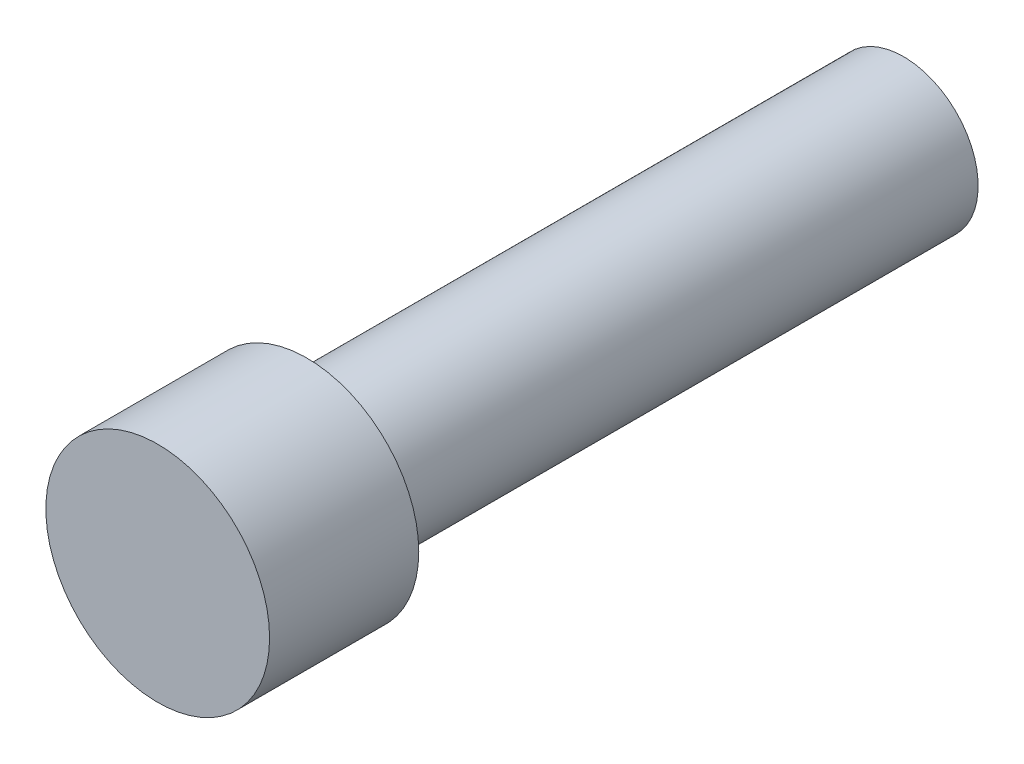
ISO-10303-21;
HEADER;
FILE_DESCRIPTION(('STEP AP214'),'2;1');
FILE_NAME('part.step','',(''),(''),'','','');
FILE_SCHEMA(('AUTOMOTIVE_DESIGN { 1 0 10303 214 1 1 1 1 }'));
ENDSEC;
DATA;
#1=APPLICATION_CONTEXT('core data for automotive mechanical design processes');
#2=APPLICATION_PROTOCOL_DEFINITION('international standard','automotive_design',2000,#1);
#3=PRODUCT_CONTEXT('',#1,'mechanical');
#4=PRODUCT('Part','Part','',(#3));
#5=PRODUCT_RELATED_PRODUCT_CATEGORY('part','',(#4));
#6=PRODUCT_DEFINITION_FORMATION('','',#4);
#7=PRODUCT_DEFINITION_CONTEXT('part definition',#1,'design');
#8=PRODUCT_DEFINITION('design','',#6,#7);
#9=PRODUCT_DEFINITION_SHAPE('','',#8);
#10=(LENGTH_UNIT() NAMED_UNIT(*) SI_UNIT(.MILLI.,.METRE.));
#11=(NAMED_UNIT(*) PLANE_ANGLE_UNIT() SI_UNIT($,.RADIAN.));
#12=(NAMED_UNIT(*) SI_UNIT($,.STERADIAN.) SOLID_ANGLE_UNIT());
#13=UNCERTAINTY_MEASURE_WITH_UNIT(LENGTH_MEASURE(1.E-05),#10,'distance_accuracy_value','');
#14=(GEOMETRIC_REPRESENTATION_CONTEXT(3) GLOBAL_UNCERTAINTY_ASSIGNED_CONTEXT((#13)) GLOBAL_UNIT_ASSIGNED_CONTEXT((#10,
#11,#12)) REPRESENTATION_CONTEXT('',''));
#15=CARTESIAN_POINT('',(0.,0.,0.));
#16=DIRECTION('',(0.,0.,1.));
#17=DIRECTION('',(1.,0.,0.));
#18=AXIS2_PLACEMENT_3D('',#15,#16,#17);
#19=CARTESIAN_POINT('',(0.,0.,2.));
#20=DIRECTION('',(0.,0.,-1.));
#21=DIRECTION('',(-1.,0.,0.));
#22=AXIS2_PLACEMENT_3D('',#19,#20,#21);
#23=CYLINDRICAL_SURFACE('',#22,1.5);
#24=CARTESIAN_POINT('',(0.,0.,2.));
#25=DIRECTION('',(0.,0.,1.));
#26=DIRECTION('',(1.,0.,0.));
#27=AXIS2_PLACEMENT_3D('',#24,#25,#26);
#28=CIRCLE('',#27,1.5);
#29=CARTESIAN_POINT('',(1.5,0.,2.));
#30=VERTEX_POINT('',#29);
#31=EDGE_CURVE('E45',#30,#30,#28,.T.);
#32=ORIENTED_EDGE('',*,*,#31,.F.);
#33=EDGE_LOOP('',(#32));
#34=FACE_BOUND('',#33,.T.);
#35=CARTESIAN_POINT('',(0.,0.,0.));
#36=DIRECTION('',(0.,0.,1.));
#37=DIRECTION('',(1.,0.,0.));
#38=AXIS2_PLACEMENT_3D('',#35,#36,#37);
#39=CIRCLE('',#38,1.5);
#40=CARTESIAN_POINT('',(1.5,0.,0.));
#41=VERTEX_POINT('',#40);
#42=EDGE_CURVE('E40',#41,#41,#39,.T.);
#43=ORIENTED_EDGE('',*,*,#42,.T.);
#44=EDGE_LOOP('',(#43));
#45=FACE_BOUND('',#44,.T.);
#46=ADVANCED_FACE('F37',(#34,#45),#23,.T.);
#47=CARTESIAN_POINT('',(0.,0.,2.));
#48=DIRECTION('',(0.,0.,1.));
#49=DIRECTION('',(1.,0.,0.));
#50=AXIS2_PLACEMENT_3D('',#47,#48,#49);
#51=PLANE('',#50);
#52=ORIENTED_EDGE('',*,*,#31,.T.);
#53=EDGE_LOOP('',(#52));
#54=FACE_BOUND('',#53,.T.);
#55=ADVANCED_FACE('F65',(#54),#51,.T.);
#56=CARTESIAN_POINT('',(0.,0.,0.));
#57=DIRECTION('',(0.,0.,1.));
#58=DIRECTION('',(1.,0.,0.));
#59=AXIS2_PLACEMENT_3D('',#56,#57,#58);
#60=PLANE('',#59);
#61=CARTESIAN_POINT('',(0.,0.,0.));
#62=DIRECTION('',(0.,0.,-1.));
#63=DIRECTION('',(-1.,0.,0.));
#64=AXIS2_PLACEMENT_3D('',#61,#62,#63);
#65=CIRCLE('',#64,1.);
#66=CARTESIAN_POINT('',(-1.,0.,0.));
#67=VERTEX_POINT('',#66);
#68=EDGE_CURVE('E10',#67,#67,#65,.T.);
#69=ORIENTED_EDGE('',*,*,#68,.F.);
#70=EDGE_LOOP('',(#69));
#71=FACE_BOUND('',#70,.T.);
#72=ORIENTED_EDGE('',*,*,#42,.F.);
#73=EDGE_LOOP('',(#72));
#74=FACE_BOUND('',#73,.T.);
#75=ADVANCED_FACE('F62',(#71,#74),#60,.F.);
#76=CARTESIAN_POINT('',(0.,0.,-8.));
#77=DIRECTION('',(0.,0.,1.));
#78=DIRECTION('',(1.,0.,0.));
#79=AXIS2_PLACEMENT_3D('',#76,#77,#78);
#80=CYLINDRICAL_SURFACE('',#79,1.);
#81=CARTESIAN_POINT('',(0.,0.,-8.));
#82=DIRECTION('',(0.,0.,-1.));
#83=DIRECTION('',(-1.,0.,0.));
#84=AXIS2_PLACEMENT_3D('',#81,#82,#83);
#85=CIRCLE('',#84,1.);
#86=CARTESIAN_POINT('',(-1.,0.,-8.));
#87=VERTEX_POINT('',#86);
#88=EDGE_CURVE('E52',#87,#87,#85,.T.);
#89=ORIENTED_EDGE('',*,*,#88,.F.);
#90=EDGE_LOOP('',(#89));
#91=FACE_BOUND('',#90,.T.);
#92=ORIENTED_EDGE('',*,*,#68,.T.);
#93=EDGE_LOOP('',(#92));
#94=FACE_BOUND('',#93,.T.);
#95=ADVANCED_FACE('F64',(#91,#94),#80,.T.);
#96=CARTESIAN_POINT('',(0.,0.,-8.));
#97=DIRECTION('',(0.,0.,-1.));
#98=DIRECTION('',(-1.,0.,0.));
#99=AXIS2_PLACEMENT_3D('',#96,#97,#98);
#100=PLANE('',#99);
#101=ORIENTED_EDGE('',*,*,#88,.T.);
#102=EDGE_LOOP('',(#101));
#103=FACE_BOUND('',#102,.T.);
#104=ADVANCED_FACE('F71',(#103),#100,.T.);
#105=CLOSED_SHELL('',(#46,#55,#75,#95,#104));
#106=MANIFOLD_SOLID_BREP('B2',#105);
#107=ADVANCED_BREP_SHAPE_REPRESENTATION('',(#18,#106),#14);
#108=SHAPE_DEFINITION_REPRESENTATION(#9,#107);
ENDSEC;
END-ISO-10303-21;
